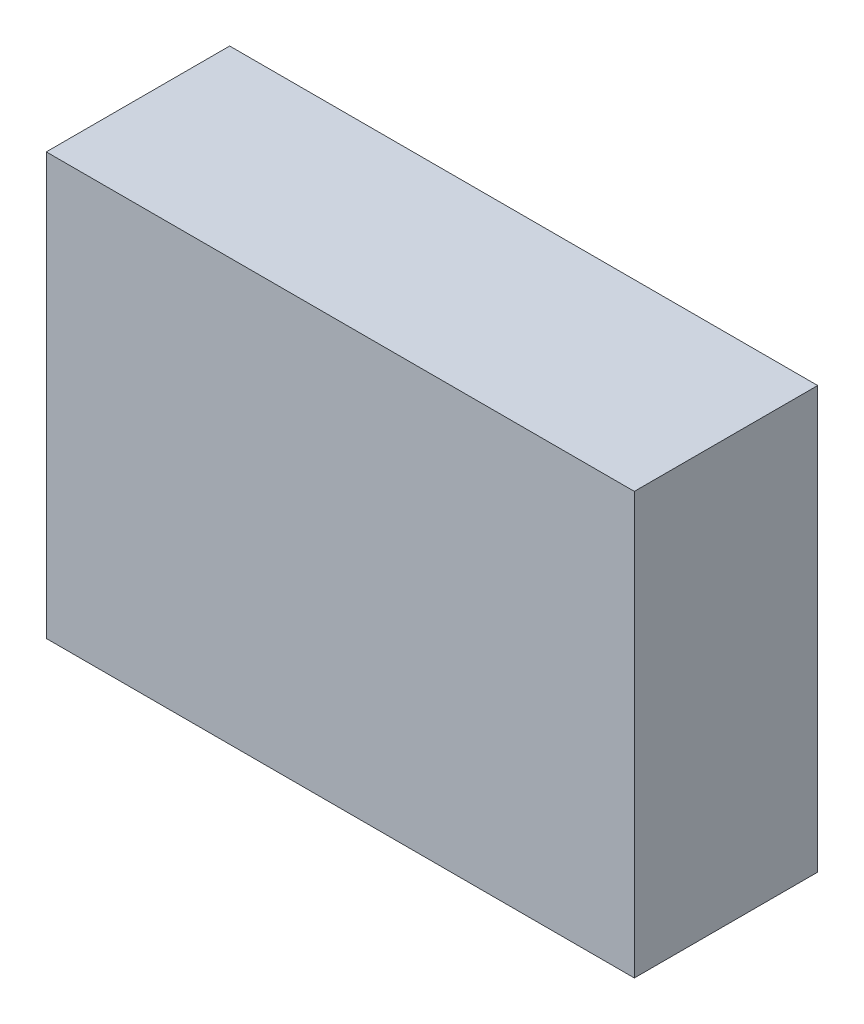
ISO-10303-21;
HEADER;
FILE_DESCRIPTION(('STEP AP214'),'2;1');
FILE_NAME('part.step','',(''),(''),'','','');
FILE_SCHEMA(('AUTOMOTIVE_DESIGN { 1 0 10303 214 1 1 1 1 }'));
ENDSEC;
DATA;
#1=APPLICATION_CONTEXT('core data for automotive mechanical design processes');
#2=APPLICATION_PROTOCOL_DEFINITION('international standard','automotive_design',2000,#1);
#3=PRODUCT_CONTEXT('',#1,'mechanical');
#4=PRODUCT('Part','Part','',(#3));
#5=PRODUCT_RELATED_PRODUCT_CATEGORY('part','',(#4));
#6=PRODUCT_DEFINITION_FORMATION('','',#4);
#7=PRODUCT_DEFINITION_CONTEXT('part definition',#1,'design');
#8=PRODUCT_DEFINITION('design','',#6,#7);
#9=PRODUCT_DEFINITION_SHAPE('','',#8);
#10=(LENGTH_UNIT() NAMED_UNIT(*) SI_UNIT(.MILLI.,.METRE.));
#11=(NAMED_UNIT(*) PLANE_ANGLE_UNIT() SI_UNIT($,.RADIAN.));
#12=(NAMED_UNIT(*) SI_UNIT($,.STERADIAN.) SOLID_ANGLE_UNIT());
#13=UNCERTAINTY_MEASURE_WITH_UNIT(LENGTH_MEASURE(1.E-05),#10,'distance_accuracy_value','');
#14=(GEOMETRIC_REPRESENTATION_CONTEXT(3) GLOBAL_UNCERTAINTY_ASSIGNED_CONTEXT((#13)) GLOBAL_UNIT_ASSIGNED_CONTEXT((#10,
#11,#12)) REPRESENTATION_CONTEXT('',''));
#15=CARTESIAN_POINT('',(0.,0.,0.));
#16=DIRECTION('',(0.,0.,1.));
#17=DIRECTION('',(1.,0.,0.));
#18=AXIS2_PLACEMENT_3D('',#15,#16,#17);
#19=CARTESIAN_POINT('',(-8.0170968272234,-5.74558605951012,5.));
#20=DIRECTION('',(1.,0.,0.));
#21=DIRECTION('',(0.,0.,-1.));
#22=AXIS2_PLACEMENT_3D('',#19,#20,#21);
#23=PLANE('',#22);
#24=DIRECTION('',(0.,-1.,0.));
#25=VECTOR('',#24,1.);
#26=CARTESIAN_POINT('',(-8.0170968272234,-5.74558605951012,0.));
#27=LINE('',#26,#25);
#28=CARTESIAN_POINT('',(-8.0170968272234,5.74558605951012,0.));
#29=VERTEX_POINT('',#28);
#30=CARTESIAN_POINT('',(-8.0170968272234,-5.74558605951012,0.));
#31=VERTEX_POINT('',#30);
#32=EDGE_CURVE('E96',#29,#31,#27,.T.);
#33=ORIENTED_EDGE('',*,*,#32,.T.);
#34=DIRECTION('',(0.,0.,-1.));
#35=VECTOR('',#34,1.);
#36=CARTESIAN_POINT('',(-8.0170968272234,-5.74558605951012,5.));
#37=LINE('',#36,#35);
#38=CARTESIAN_POINT('',(-8.0170968272234,-5.74558605951012,5.));
#39=VERTEX_POINT('',#38);
#40=EDGE_CURVE('E11',#39,#31,#37,.T.);
#41=ORIENTED_EDGE('',*,*,#40,.F.);
#42=DIRECTION('',(0.,-1.,0.));
#43=VECTOR('',#42,1.);
#44=CARTESIAN_POINT('',(-8.0170968272234,-5.74558605951012,5.));
#45=LINE('',#44,#43);
#46=CARTESIAN_POINT('',(-8.0170968272234,5.74558605951012,5.));
#47=VERTEX_POINT('',#46);
#48=EDGE_CURVE('E84',#47,#39,#45,.T.);
#49=ORIENTED_EDGE('',*,*,#48,.F.);
#50=DIRECTION('',(0.,0.,-1.));
#51=VECTOR('',#50,1.);
#52=CARTESIAN_POINT('',(-8.0170968272234,5.74558605951012,5.));
#53=LINE('',#52,#51);
#54=EDGE_CURVE('E92',#47,#29,#53,.T.);
#55=ORIENTED_EDGE('',*,*,#54,.T.);
#56=EDGE_LOOP('',(#33,#41,#49,#55));
#57=FACE_BOUND('',#56,.T.);
#58=ADVANCED_FACE('F33',(#57),#23,.F.);
#59=CARTESIAN_POINT('',(8.0170968272234,-5.74558605951012,5.));
#60=DIRECTION('',(0.,1.,0.));
#61=DIRECTION('',(0.,0.,1.));
#62=AXIS2_PLACEMENT_3D('',#59,#60,#61);
#63=PLANE('',#62);
#64=DIRECTION('',(1.,0.,0.));
#65=VECTOR('',#64,1.);
#66=CARTESIAN_POINT('',(8.0170968272234,-5.74558605951012,0.));
#67=LINE('',#66,#65);
#68=CARTESIAN_POINT('',(8.0170968272234,-5.74558605951012,0.));
#69=VERTEX_POINT('',#68);
#70=EDGE_CURVE('E88',#31,#69,#67,.T.);
#71=ORIENTED_EDGE('',*,*,#70,.T.);
#72=DIRECTION('',(0.,0.,-1.));
#73=VECTOR('',#72,1.);
#74=CARTESIAN_POINT('',(8.0170968272234,-5.74558605951012,5.));
#75=LINE('',#74,#73);
#76=CARTESIAN_POINT('',(8.0170968272234,-5.74558605951012,5.));
#77=VERTEX_POINT('',#76);
#78=EDGE_CURVE('E41',#77,#69,#75,.T.);
#79=ORIENTED_EDGE('',*,*,#78,.F.);
#80=DIRECTION('',(1.,0.,0.));
#81=VECTOR('',#80,1.);
#82=CARTESIAN_POINT('',(8.0170968272234,-5.74558605951012,5.));
#83=LINE('',#82,#81);
#84=EDGE_CURVE('E79',#39,#77,#83,.T.);
#85=ORIENTED_EDGE('',*,*,#84,.F.);
#86=ORIENTED_EDGE('',*,*,#40,.T.);
#87=EDGE_LOOP('',(#71,#79,#85,#86));
#88=FACE_BOUND('',#87,.T.);
#89=ADVANCED_FACE('F87',(#88),#63,.F.);
#90=CARTESIAN_POINT('',(8.0170968272234,-5.74558605951012,5.));
#91=DIRECTION('',(-1.,0.,0.));
#92=DIRECTION('',(0.,0.,1.));
#93=AXIS2_PLACEMENT_3D('',#90,#91,#92);
#94=PLANE('',#93);
#95=DIRECTION('',(0.,1.,0.));
#96=VECTOR('',#95,1.);
#97=CARTESIAN_POINT('',(8.0170968272234,-5.74558605951012,0.));
#98=LINE('',#97,#96);
#99=CARTESIAN_POINT('',(8.0170968272234,5.74558605951012,0.));
#100=VERTEX_POINT('',#99);
#101=EDGE_CURVE('E66',#69,#100,#98,.T.);
#102=ORIENTED_EDGE('',*,*,#101,.T.);
#103=DIRECTION('',(0.,0.,-1.));
#104=VECTOR('',#103,1.);
#105=CARTESIAN_POINT('',(8.0170968272234,5.74558605951012,5.));
#106=LINE('',#105,#104);
#107=CARTESIAN_POINT('',(8.0170968272234,5.74558605951012,5.));
#108=VERTEX_POINT('',#107);
#109=EDGE_CURVE('E89',#108,#100,#106,.T.);
#110=ORIENTED_EDGE('',*,*,#109,.F.);
#111=DIRECTION('',(0.,1.,0.));
#112=VECTOR('',#111,1.);
#113=CARTESIAN_POINT('',(8.0170968272234,-5.74558605951012,5.));
#114=LINE('',#113,#112);
#115=EDGE_CURVE('E82',#77,#108,#114,.T.);
#116=ORIENTED_EDGE('',*,*,#115,.F.);
#117=ORIENTED_EDGE('',*,*,#78,.T.);
#118=EDGE_LOOP('',(#102,#110,#116,#117));
#119=FACE_BOUND('',#118,.T.);
#120=ADVANCED_FACE('F90',(#119),#94,.F.);
#121=CARTESIAN_POINT('',(8.0170968272234,5.74558605951012,5.));
#122=DIRECTION('',(0.,-1.,0.));
#123=DIRECTION('',(0.,0.,-1.));
#124=AXIS2_PLACEMENT_3D('',#121,#122,#123);
#125=PLANE('',#124);
#126=DIRECTION('',(-1.,0.,0.));
#127=VECTOR('',#126,1.);
#128=CARTESIAN_POINT('',(8.0170968272234,5.74558605951012,0.));
#129=LINE('',#128,#127);
#130=EDGE_CURVE('E72',#100,#29,#129,.T.);
#131=ORIENTED_EDGE('',*,*,#130,.T.);
#132=ORIENTED_EDGE('',*,*,#54,.F.);
#133=DIRECTION('',(-1.,0.,0.));
#134=VECTOR('',#133,1.);
#135=CARTESIAN_POINT('',(8.0170968272234,5.74558605951012,5.));
#136=LINE('',#135,#134);
#137=EDGE_CURVE('E49',#108,#47,#136,.T.);
#138=ORIENTED_EDGE('',*,*,#137,.F.);
#139=ORIENTED_EDGE('',*,*,#109,.T.);
#140=EDGE_LOOP('',(#131,#132,#138,#139));
#141=FACE_BOUND('',#140,.T.);
#142=ADVANCED_FACE('F103',(#141),#125,.F.);
#143=CARTESIAN_POINT('',(0.,0.,5.));
#144=DIRECTION('',(0.,0.,1.));
#145=DIRECTION('',(1.,0.,0.));
#146=AXIS2_PLACEMENT_3D('',#143,#144,#145);
#147=PLANE('',#146);
#148=ORIENTED_EDGE('',*,*,#48,.T.);
#149=ORIENTED_EDGE('',*,*,#84,.T.);
#150=ORIENTED_EDGE('',*,*,#115,.T.);
#151=ORIENTED_EDGE('',*,*,#137,.T.);
#152=EDGE_LOOP('',(#148,#149,#150,#151));
#153=FACE_BOUND('',#152,.T.);
#154=ADVANCED_FACE('F80',(#153),#147,.T.);
#155=CARTESIAN_POINT('',(0.,0.,0.));
#156=DIRECTION('',(0.,0.,1.));
#157=DIRECTION('',(1.,0.,0.));
#158=AXIS2_PLACEMENT_3D('',#155,#156,#157);
#159=PLANE('',#158);
#160=ORIENTED_EDGE('',*,*,#32,.F.);
#161=ORIENTED_EDGE('',*,*,#130,.F.);
#162=ORIENTED_EDGE('',*,*,#101,.F.);
#163=ORIENTED_EDGE('',*,*,#70,.F.);
#164=EDGE_LOOP('',(#160,#161,#162,#163));
#165=FACE_BOUND('',#164,.T.);
#166=ADVANCED_FACE('F106',(#165),#159,.F.);
#167=CLOSED_SHELL('',(#58,#89,#120,#142,#154,#166));
#168=MANIFOLD_SOLID_BREP('B2',#167);
#169=ADVANCED_BREP_SHAPE_REPRESENTATION('',(#18,#168),#14);
#170=SHAPE_DEFINITION_REPRESENTATION(#9,#169);
ENDSEC;
END-ISO-10303-21;
